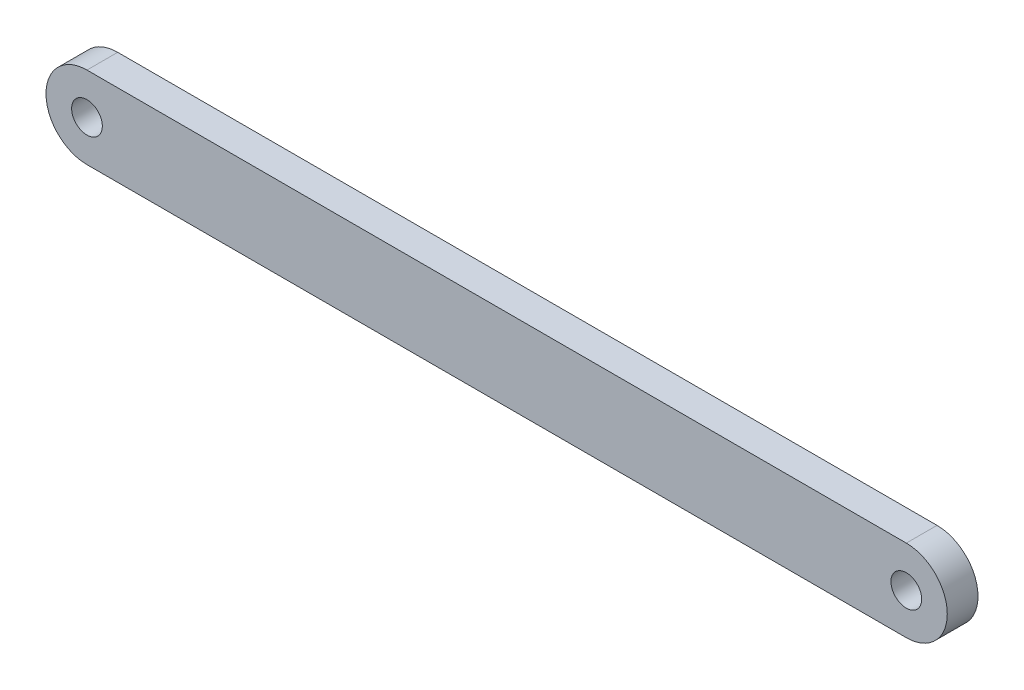
ISO-10303-21;
HEADER;
FILE_DESCRIPTION(('STEP AP214'),'2;1');
FILE_NAME('part.step','',(''),(''),'','','');
FILE_SCHEMA(('AUTOMOTIVE_DESIGN { 1 0 10303 214 1 1 1 1 }'));
ENDSEC;
DATA;
#1=APPLICATION_CONTEXT('core data for automotive mechanical design processes');
#2=APPLICATION_PROTOCOL_DEFINITION('international standard','automotive_design',2000,#1);
#3=PRODUCT_CONTEXT('',#1,'mechanical');
#4=PRODUCT('Part','Part','',(#3));
#5=PRODUCT_RELATED_PRODUCT_CATEGORY('part','',(#4));
#6=PRODUCT_DEFINITION_FORMATION('','',#4);
#7=PRODUCT_DEFINITION_CONTEXT('part definition',#1,'design');
#8=PRODUCT_DEFINITION('design','',#6,#7);
#9=PRODUCT_DEFINITION_SHAPE('','',#8);
#10=(LENGTH_UNIT() NAMED_UNIT(*) SI_UNIT(.MILLI.,.METRE.));
#11=(NAMED_UNIT(*) PLANE_ANGLE_UNIT() SI_UNIT($,.RADIAN.));
#12=(NAMED_UNIT(*) SI_UNIT($,.STERADIAN.) SOLID_ANGLE_UNIT());
#13=UNCERTAINTY_MEASURE_WITH_UNIT(LENGTH_MEASURE(1.E-05),#10,'distance_accuracy_value','');
#14=(GEOMETRIC_REPRESENTATION_CONTEXT(3) GLOBAL_UNCERTAINTY_ASSIGNED_CONTEXT((#13)) GLOBAL_UNIT_ASSIGNED_CONTEXT((#10,
#11,#12)) REPRESENTATION_CONTEXT('',''));
#15=CARTESIAN_POINT('',(0.,0.,0.));
#16=DIRECTION('',(0.,0.,1.));
#17=DIRECTION('',(1.,0.,0.));
#18=AXIS2_PLACEMENT_3D('',#15,#16,#17);
#19=CARTESIAN_POINT('',(-40.,0.,3.));
#20=DIRECTION('',(0.,0.,-1.));
#21=DIRECTION('',(-1.,0.,0.));
#22=AXIS2_PLACEMENT_3D('',#19,#20,#21);
#23=CYLINDRICAL_SURFACE('',#22,4.);
#24=CARTESIAN_POINT('',(-40.,0.,0.));
#25=DIRECTION('',(0.,0.,1.));
#26=DIRECTION('',(1.,0.,0.));
#27=AXIS2_PLACEMENT_3D('',#24,#25,#26);
#28=CIRCLE('',#27,4.);
#29=CARTESIAN_POINT('',(-40.,4.,0.));
#30=VERTEX_POINT('',#29);
#31=CARTESIAN_POINT('',(-40.,-4.,0.));
#32=VERTEX_POINT('',#31);
#33=EDGE_CURVE('E97',#30,#32,#28,.T.);
#34=ORIENTED_EDGE('',*,*,#33,.T.);
#35=DIRECTION('',(0.,0.,-1.));
#36=VECTOR('',#35,1.);
#37=CARTESIAN_POINT('',(-40.,-4.,3.));
#38=LINE('',#37,#36);
#39=CARTESIAN_POINT('',(-40.,-4.,3.));
#40=VERTEX_POINT('',#39);
#41=EDGE_CURVE('E11',#40,#32,#38,.T.);
#42=ORIENTED_EDGE('',*,*,#41,.F.);
#43=CARTESIAN_POINT('',(-40.,0.,3.));
#44=DIRECTION('',(0.,0.,1.));
#45=DIRECTION('',(1.,0.,0.));
#46=AXIS2_PLACEMENT_3D('',#43,#44,#45);
#47=CIRCLE('',#46,4.);
#48=CARTESIAN_POINT('',(-40.,4.,3.));
#49=VERTEX_POINT('',#48);
#50=EDGE_CURVE('E85',#49,#40,#47,.T.);
#51=ORIENTED_EDGE('',*,*,#50,.F.);
#52=DIRECTION('',(0.,0.,-1.));
#53=VECTOR('',#52,1.);
#54=CARTESIAN_POINT('',(-40.,4.,3.));
#55=LINE('',#54,#53);
#56=EDGE_CURVE('E93',#49,#30,#55,.T.);
#57=ORIENTED_EDGE('',*,*,#56,.T.);
#58=EDGE_LOOP('',(#34,#42,#51,#57));
#59=FACE_BOUND('',#58,.T.);
#60=ADVANCED_FACE('F34',(#59),#23,.T.);
#61=CARTESIAN_POINT('',(-40.,-4.,3.));
#62=DIRECTION('',(0.,1.,0.));
#63=DIRECTION('',(-1.,0.,0.));
#64=AXIS2_PLACEMENT_3D('',#61,#62,#63);
#65=PLANE('',#64);
#66=DIRECTION('',(1.,0.,0.));
#67=VECTOR('',#66,1.);
#68=CARTESIAN_POINT('',(-40.,-4.,0.));
#69=LINE('',#68,#67);
#70=CARTESIAN_POINT('',(40.,-3.99999999999999,0.));
#71=VERTEX_POINT('',#70);
#72=EDGE_CURVE('E89',#32,#71,#69,.T.);
#73=ORIENTED_EDGE('',*,*,#72,.T.);
#74=DIRECTION('',(0.,0.,-1.));
#75=VECTOR('',#74,1.);
#76=CARTESIAN_POINT('',(40.,-3.99999999999999,3.));
#77=LINE('',#76,#75);
#78=CARTESIAN_POINT('',(40.,-3.99999999999999,3.));
#79=VERTEX_POINT('',#78);
#80=EDGE_CURVE('E42',#79,#71,#77,.T.);
#81=ORIENTED_EDGE('',*,*,#80,.F.);
#82=DIRECTION('',(1.,0.,0.));
#83=VECTOR('',#82,1.);
#84=CARTESIAN_POINT('',(-40.,-4.,3.));
#85=LINE('',#84,#83);
#86=EDGE_CURVE('E80',#40,#79,#85,.T.);
#87=ORIENTED_EDGE('',*,*,#86,.F.);
#88=ORIENTED_EDGE('',*,*,#41,.T.);
#89=EDGE_LOOP('',(#73,#81,#87,#88));
#90=FACE_BOUND('',#89,.T.);
#91=ADVANCED_FACE('F88',(#90),#65,.F.);
#92=CARTESIAN_POINT('',(40.,0.,3.));
#93=DIRECTION('',(0.,0.,-1.));
#94=DIRECTION('',(-1.,0.,0.));
#95=AXIS2_PLACEMENT_3D('',#92,#93,#94);
#96=CYLINDRICAL_SURFACE('',#95,4.);
#97=CARTESIAN_POINT('',(40.,0.,0.));
#98=DIRECTION('',(0.,0.,1.));
#99=DIRECTION('',(1.,0.,0.));
#100=AXIS2_PLACEMENT_3D('',#97,#98,#99);
#101=CIRCLE('',#100,4.);
#102=CARTESIAN_POINT('',(40.,4.00000000000002,0.));
#103=VERTEX_POINT('',#102);
#104=EDGE_CURVE('E67',#71,#103,#101,.T.);
#105=ORIENTED_EDGE('',*,*,#104,.T.);
#106=DIRECTION('',(0.,0.,-1.));
#107=VECTOR('',#106,1.);
#108=CARTESIAN_POINT('',(40.,4.00000000000002,3.));
#109=LINE('',#108,#107);
#110=CARTESIAN_POINT('',(40.,4.00000000000002,3.));
#111=VERTEX_POINT('',#110);
#112=EDGE_CURVE('E90',#111,#103,#109,.T.);
#113=ORIENTED_EDGE('',*,*,#112,.F.);
#114=CARTESIAN_POINT('',(40.,0.,3.));
#115=DIRECTION('',(0.,0.,1.));
#116=DIRECTION('',(1.,0.,0.));
#117=AXIS2_PLACEMENT_3D('',#114,#115,#116);
#118=CIRCLE('',#117,4.);
#119=EDGE_CURVE('E83',#79,#111,#118,.T.);
#120=ORIENTED_EDGE('',*,*,#119,.F.);
#121=ORIENTED_EDGE('',*,*,#80,.T.);
#122=EDGE_LOOP('',(#105,#113,#120,#121));
#123=FACE_BOUND('',#122,.T.);
#124=ADVANCED_FACE('F91',(#123),#96,.T.);
#125=CARTESIAN_POINT('',(-40.,4.,3.));
#126=DIRECTION('',(0.,-1.,0.));
#127=DIRECTION('',(1.,0.,0.));
#128=AXIS2_PLACEMENT_3D('',#125,#126,#127);
#129=PLANE('',#128);
#130=DIRECTION('',(-1.,0.,0.));
#131=VECTOR('',#130,1.);
#132=CARTESIAN_POINT('',(-40.,4.,0.));
#133=LINE('',#132,#131);
#134=EDGE_CURVE('E73',#103,#30,#133,.T.);
#135=ORIENTED_EDGE('',*,*,#134,.T.);
#136=ORIENTED_EDGE('',*,*,#56,.F.);
#137=DIRECTION('',(-1.,0.,0.));
#138=VECTOR('',#137,1.);
#139=CARTESIAN_POINT('',(-40.,4.,3.));
#140=LINE('',#139,#138);
#141=EDGE_CURVE('E50',#111,#49,#140,.T.);
#142=ORIENTED_EDGE('',*,*,#141,.F.);
#143=ORIENTED_EDGE('',*,*,#112,.T.);
#144=EDGE_LOOP('',(#135,#136,#142,#143));
#145=FACE_BOUND('',#144,.T.);
#146=ADVANCED_FACE('F105',(#145),#129,.F.);
#147=CARTESIAN_POINT('',(-40.,0.,3.));
#148=DIRECTION('',(0.,0.,1.));
#149=DIRECTION('',(1.,0.,0.));
#150=AXIS2_PLACEMENT_3D('',#147,#148,#149);
#151=PLANE('',#150);
#152=CARTESIAN_POINT('',(-40.,0.,3.));
#153=DIRECTION('',(0.,0.,1.));
#154=DIRECTION('',(1.,0.,0.));
#155=AXIS2_PLACEMENT_3D('',#152,#153,#154);
#156=CIRCLE('',#155,1.49999999999999);
#157=CARTESIAN_POINT('',(-38.5,0.,3.));
#158=VERTEX_POINT('',#157);
#159=EDGE_CURVE('E119',#158,#158,#156,.T.);
#160=ORIENTED_EDGE('',*,*,#159,.F.);
#161=EDGE_LOOP('',(#160));
#162=FACE_BOUND('',#161,.T.);
#163=CARTESIAN_POINT('',(40.,0.,3.));
#164=DIRECTION('',(0.,0.,1.));
#165=DIRECTION('',(1.,0.,0.));
#166=AXIS2_PLACEMENT_3D('',#163,#164,#165);
#167=CIRCLE('',#166,1.49999999999999);
#168=CARTESIAN_POINT('',(41.5,0.,3.));
#169=VERTEX_POINT('',#168);
#170=EDGE_CURVE('E113',#169,#169,#167,.T.);
#171=ORIENTED_EDGE('',*,*,#170,.F.);
#172=EDGE_LOOP('',(#171));
#173=FACE_BOUND('',#172,.T.);
#174=ORIENTED_EDGE('',*,*,#50,.T.);
#175=ORIENTED_EDGE('',*,*,#86,.T.);
#176=ORIENTED_EDGE('',*,*,#119,.T.);
#177=ORIENTED_EDGE('',*,*,#141,.T.);
#178=EDGE_LOOP('',(#174,#175,#176,#177));
#179=FACE_BOUND('',#178,.T.);
#180=ADVANCED_FACE('F81',(#162,#173,#179),#151,.T.);
#181=CARTESIAN_POINT('',(-40.,0.,0.));
#182=DIRECTION('',(0.,0.,1.));
#183=DIRECTION('',(1.,0.,0.));
#184=AXIS2_PLACEMENT_3D('',#181,#182,#183);
#185=PLANE('',#184);
#186=CARTESIAN_POINT('',(-40.,0.,0.));
#187=DIRECTION('',(0.,0.,1.));
#188=DIRECTION('',(1.,0.,0.));
#189=AXIS2_PLACEMENT_3D('',#186,#187,#188);
#190=CIRCLE('',#189,1.49999999999999);
#191=CARTESIAN_POINT('',(-38.5,0.,0.));
#192=VERTEX_POINT('',#191);
#193=EDGE_CURVE('E116',#192,#192,#190,.T.);
#194=ORIENTED_EDGE('',*,*,#193,.T.);
#195=EDGE_LOOP('',(#194));
#196=FACE_BOUND('',#195,.T.);
#197=CARTESIAN_POINT('',(40.,0.,0.));
#198=DIRECTION('',(0.,0.,1.));
#199=DIRECTION('',(1.,0.,0.));
#200=AXIS2_PLACEMENT_3D('',#197,#198,#199);
#201=CIRCLE('',#200,1.49999999999999);
#202=CARTESIAN_POINT('',(41.5,0.,0.));
#203=VERTEX_POINT('',#202);
#204=EDGE_CURVE('E100',#203,#203,#201,.T.);
#205=ORIENTED_EDGE('',*,*,#204,.T.);
#206=EDGE_LOOP('',(#205));
#207=FACE_BOUND('',#206,.T.);
#208=ORIENTED_EDGE('',*,*,#33,.F.);
#209=ORIENTED_EDGE('',*,*,#134,.F.);
#210=ORIENTED_EDGE('',*,*,#104,.F.);
#211=ORIENTED_EDGE('',*,*,#72,.F.);
#212=EDGE_LOOP('',(#208,#209,#210,#211));
#213=FACE_BOUND('',#212,.T.);
#214=ADVANCED_FACE('F108',(#196,#207,#213),#185,.F.);
#215=CARTESIAN_POINT('',(40.,0.,3.));
#216=DIRECTION('',(0.,0.,1.));
#217=DIRECTION('',(1.,0.,0.));
#218=AXIS2_PLACEMENT_3D('',#215,#216,#217);
#219=CYLINDRICAL_SURFACE('',#218,1.49999999999999);
#220=ORIENTED_EDGE('',*,*,#204,.F.);
#221=EDGE_LOOP('',(#220));
#222=FACE_BOUND('',#221,.T.);
#223=ORIENTED_EDGE('',*,*,#170,.T.);
#224=EDGE_LOOP('',(#223));
#225=FACE_BOUND('',#224,.T.);
#226=ADVANCED_FACE('F130',(#222,#225),#219,.F.);
#227=CARTESIAN_POINT('',(-40.,0.,3.));
#228=DIRECTION('',(0.,0.,1.));
#229=DIRECTION('',(1.,0.,0.));
#230=AXIS2_PLACEMENT_3D('',#227,#228,#229);
#231=CYLINDRICAL_SURFACE('',#230,1.49999999999999);
#232=ORIENTED_EDGE('',*,*,#193,.F.);
#233=EDGE_LOOP('',(#232));
#234=FACE_BOUND('',#233,.T.);
#235=ORIENTED_EDGE('',*,*,#159,.T.);
#236=EDGE_LOOP('',(#235));
#237=FACE_BOUND('',#236,.T.);
#238=ADVANCED_FACE('F123',(#234,#237),#231,.F.);
#239=CLOSED_SHELL('',(#60,#91,#124,#146,#180,#214,#226,#238));
#240=MANIFOLD_SOLID_BREP('B2',#239);
#241=ADVANCED_BREP_SHAPE_REPRESENTATION('',(#18,#240),#14);
#242=SHAPE_DEFINITION_REPRESENTATION(#9,#241);
ENDSEC;
END-ISO-10303-21;
